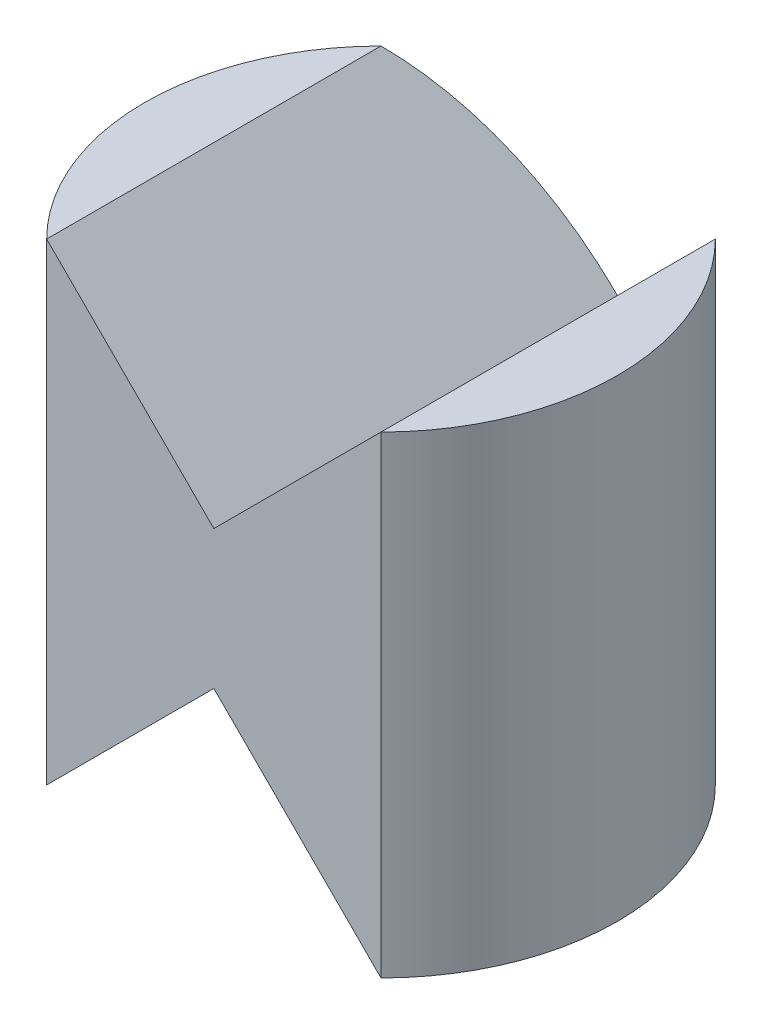
ISO-10303-21;
HEADER;
FILE_DESCRIPTION(('STEP AP214'),'2;1');
FILE_NAME('part.step','',(''),(''),'','','');
FILE_SCHEMA(('AUTOMOTIVE_DESIGN { 1 0 10303 214 1 1 1 1 }'));
ENDSEC;
DATA;
#1=APPLICATION_CONTEXT('core data for automotive mechanical design processes');
#2=APPLICATION_PROTOCOL_DEFINITION('international standard','automotive_design',2000,#1);
#3=PRODUCT_CONTEXT('',#1,'mechanical');
#4=PRODUCT('Part','Part','',(#3));
#5=PRODUCT_RELATED_PRODUCT_CATEGORY('part','',(#4));
#6=PRODUCT_DEFINITION_FORMATION('','',#4);
#7=PRODUCT_DEFINITION_CONTEXT('part definition',#1,'design');
#8=PRODUCT_DEFINITION('design','',#6,#7);
#9=PRODUCT_DEFINITION_SHAPE('','',#8);
#10=(LENGTH_UNIT() NAMED_UNIT(*) SI_UNIT(.MILLI.,.METRE.));
#11=(NAMED_UNIT(*) PLANE_ANGLE_UNIT() SI_UNIT($,.RADIAN.));
#12=(NAMED_UNIT(*) SI_UNIT($,.STERADIAN.) SOLID_ANGLE_UNIT());
#13=UNCERTAINTY_MEASURE_WITH_UNIT(LENGTH_MEASURE(1.E-05),#10,'distance_accuracy_value','');
#14=(GEOMETRIC_REPRESENTATION_CONTEXT(3) GLOBAL_UNCERTAINTY_ASSIGNED_CONTEXT((#13)) GLOBAL_UNIT_ASSIGNED_CONTEXT((#10,
#11,#12)) REPRESENTATION_CONTEXT('',''));
#15=CARTESIAN_POINT('',(0.,0.,0.));
#16=DIRECTION('',(0.,0.,1.));
#17=DIRECTION('',(1.,0.,0.));
#18=AXIS2_PLACEMENT_3D('',#15,#16,#17);
#19=CARTESIAN_POINT('',(0.,5.,0.));
#20=DIRECTION('',(0.,-1.,0.));
#21=DIRECTION('',(0.,0.,-1.));
#22=AXIS2_PLACEMENT_3D('',#19,#20,#21);
#23=PLANE('',#22);
#24=CARTESIAN_POINT('',(0.,5.,0.));
#25=DIRECTION('',(0.,1.,0.));
#26=DIRECTION('',(0.,0.,-1.));
#27=AXIS2_PLACEMENT_3D('',#24,#25,#26);
#28=CIRCLE('',#27,2.5);
#29=CARTESIAN_POINT('',(1.76776695296637,5.,1.76776695296637));
#30=VERTEX_POINT('',#29);
#31=CARTESIAN_POINT('',(1.76776695296637,5.,-1.76776695296637));
#32=VERTEX_POINT('',#31);
#33=EDGE_CURVE('E136',#30,#32,#28,.T.);
#34=ORIENTED_EDGE('',*,*,#33,.T.);
#35=DIRECTION('',(0.,0.,1.));
#36=VECTOR('',#35,1.);
#37=CARTESIAN_POINT('',(1.76776695296637,5.,-2.501));
#38=LINE('',#37,#36);
#39=EDGE_CURVE('E165',#32,#30,#38,.T.);
#40=ORIENTED_EDGE('',*,*,#39,.T.);
#41=EDGE_LOOP('',(#34,#40));
#42=FACE_BOUND('',#41,.T.);
#43=ADVANCED_FACE('F45',(#42),#23,.F.);
#44=CARTESIAN_POINT('',(0.,0.,0.));
#45=DIRECTION('',(0.,-1.,0.));
#46=DIRECTION('',(0.,0.,-1.));
#47=AXIS2_PLACEMENT_3D('',#44,#45,#46);
#48=PLANE('',#47);
#49=DIRECTION('',(0.,0.,1.));
#50=VECTOR('',#49,1.);
#51=CARTESIAN_POINT('',(-1.76776695296637,0.,-2.501));
#52=LINE('',#51,#50);
#53=CARTESIAN_POINT('',(-1.76776695296637,0.,-1.76776695296637));
#54=VERTEX_POINT('',#53);
#55=CARTESIAN_POINT('',(-1.76776695296637,0.,1.76776695296637));
#56=VERTEX_POINT('',#55);
#57=EDGE_CURVE('E149',#54,#56,#52,.T.);
#58=ORIENTED_EDGE('',*,*,#57,.T.);
#59=CARTESIAN_POINT('',(0.,0.,0.));
#60=DIRECTION('',(0.,1.,0.));
#61=DIRECTION('',(0.,0.,-1.));
#62=AXIS2_PLACEMENT_3D('',#59,#60,#61);
#63=CIRCLE('',#62,2.5);
#64=EDGE_CURVE('E142',#54,#56,#63,.T.);
#65=ORIENTED_EDGE('',*,*,#64,.F.);
#66=EDGE_LOOP('',(#58,#65));
#67=FACE_BOUND('',#66,.T.);
#68=ADVANCED_FACE('F207',(#67),#48,.T.);
#69=CARTESIAN_POINT('',(0.,5.,0.));
#70=DIRECTION('',(0.,-1.,0.));
#71=DIRECTION('',(0.,0.,-1.));
#72=AXIS2_PLACEMENT_3D('',#69,#70,#71);
#73=CYLINDRICAL_SURFACE('',#72,2.5);
#74=CARTESIAN_POINT('',(0.,1.76776695296637,0.));
#75=DIRECTION('',(0.707106781186547,0.707106781186547,0.));
#76=DIRECTION('',(0.707106781186548,-0.707106781186548,0.));
#77=AXIS2_PLACEMENT_3D('',#74,#75,#76);
#78=ELLIPSE('',#77,3.53553390593274,2.5);
#79=CARTESIAN_POINT('',(0.,1.76776695296637,-2.5));
#80=VERTEX_POINT('',#79);
#81=CARTESIAN_POINT('',(1.76776695296637,0.,-1.76776695296637));
#82=VERTEX_POINT('',#81);
#83=EDGE_CURVE('E75',#80,#82,#78,.F.);
#84=ORIENTED_EDGE('',*,*,#83,.F.);
#85=CARTESIAN_POINT('',(0.,1.76776695296637,0.));
#86=DIRECTION('',(-0.707106781186548,0.707106781186547,0.));
#87=DIRECTION('',(-0.707106781186547,-0.707106781186548,0.));
#88=AXIS2_PLACEMENT_3D('',#85,#86,#87);
#89=ELLIPSE('',#88,3.53553390593274,2.5);
#90=EDGE_CURVE('E130',#54,#80,#89,.F.);
#91=ORIENTED_EDGE('',*,*,#90,.F.);
#92=ORIENTED_EDGE('',*,*,#64,.T.);
#93=DIRECTION('',(0.,-1.,0.));
#94=VECTOR('',#93,1.);
#95=CARTESIAN_POINT('',(-1.76776695296637,5.,1.76776695296637));
#96=LINE('',#95,#94);
#97=CARTESIAN_POINT('',(-1.76776695296637,5.,1.76776695296637));
#98=VERTEX_POINT('',#97);
#99=EDGE_CURVE('E11',#98,#56,#96,.T.);
#100=ORIENTED_EDGE('',*,*,#99,.F.);
#101=CARTESIAN_POINT('',(-1.76776695296637,5.,-1.76776695296637));
#102=VERTEX_POINT('',#101);
#103=EDGE_CURVE('E141',#102,#98,#28,.T.);
#104=ORIENTED_EDGE('',*,*,#103,.F.);
#105=CARTESIAN_POINT('',(0.,3.23223304703363,0.));
#106=DIRECTION('',(-0.707106781186547,-0.707106781186547,0.));
#107=DIRECTION('',(0.707106781186548,-0.707106781186548,0.));
#108=AXIS2_PLACEMENT_3D('',#105,#106,#107);
#109=ELLIPSE('',#108,3.53553390593274,2.5);
#110=CARTESIAN_POINT('',(0.,3.23223304703363,-2.5));
#111=VERTEX_POINT('',#110);
#112=EDGE_CURVE('E66',#111,#102,#109,.F.);
#113=ORIENTED_EDGE('',*,*,#112,.F.);
#114=CARTESIAN_POINT('',(0.,3.23223304703363,0.));
#115=DIRECTION('',(0.707106781186547,-0.707106781186548,0.));
#116=DIRECTION('',(-0.707106781186548,-0.707106781186547,0.));
#117=AXIS2_PLACEMENT_3D('',#114,#115,#116);
#118=ELLIPSE('',#117,3.53553390593274,2.5);
#119=EDGE_CURVE('E175',#32,#111,#118,.F.);
#120=ORIENTED_EDGE('',*,*,#119,.F.);
#121=ORIENTED_EDGE('',*,*,#33,.F.);
#122=DIRECTION('',(0.,-1.,0.));
#123=VECTOR('',#122,1.);
#124=CARTESIAN_POINT('',(1.76776695296637,5.,1.76776695296637));
#125=LINE('',#124,#123);
#126=CARTESIAN_POINT('',(1.76776695296637,0.,1.76776695296637));
#127=VERTEX_POINT('',#126);
#128=EDGE_CURVE('E55',#30,#127,#125,.T.);
#129=ORIENTED_EDGE('',*,*,#128,.T.);
#130=EDGE_CURVE('E133',#127,#82,#63,.T.);
#131=ORIENTED_EDGE('',*,*,#130,.T.);
#132=EDGE_LOOP('',(#84,#91,#92,#100,#104,#113,#120,#121,#129,#131));
#133=FACE_BOUND('',#132,.T.);
#134=ADVANCED_FACE('F47',(#133),#73,.T.);
#135=CARTESIAN_POINT('',(-1.76776695296637,5.,1.76776695296637));
#136=DIRECTION('',(0.,0.,-1.));
#137=DIRECTION('',(-1.,0.,0.));
#138=AXIS2_PLACEMENT_3D('',#135,#136,#137);
#139=PLANE('',#138);
#140=ORIENTED_EDGE('',*,*,#99,.T.);
#141=DIRECTION('',(-0.707106781186547,-0.707106781186548,0.));
#142=VECTOR('',#141,1.);
#143=CARTESIAN_POINT('',(-1.76776695296637,0.,1.76776695296637));
#144=LINE('',#143,#142);
#145=CARTESIAN_POINT('',(0.,1.76776695296637,1.76776695296637));
#146=VERTEX_POINT('',#145);
#147=EDGE_CURVE('E121',#146,#56,#144,.T.);
#148=ORIENTED_EDGE('',*,*,#147,.F.);
#149=DIRECTION('',(-0.707106781186548,0.707106781186548,0.));
#150=VECTOR('',#149,1.);
#151=CARTESIAN_POINT('',(0.,1.76776695296637,1.76776695296637));
#152=LINE('',#151,#150);
#153=EDGE_CURVE('E114',#127,#146,#152,.T.);
#154=ORIENTED_EDGE('',*,*,#153,.F.);
#155=ORIENTED_EDGE('',*,*,#128,.F.);
#156=DIRECTION('',(0.707106781186548,0.707106781186547,0.));
#157=VECTOR('',#156,1.);
#158=CARTESIAN_POINT('',(0.,3.23223304703363,1.76776695296637));
#159=LINE('',#158,#157);
#160=CARTESIAN_POINT('',(0.,3.23223304703363,1.76776695296637));
#161=VERTEX_POINT('',#160);
#162=EDGE_CURVE('E183',#161,#30,#159,.T.);
#163=ORIENTED_EDGE('',*,*,#162,.F.);
#164=DIRECTION('',(0.707106781186547,-0.707106781186547,0.));
#165=VECTOR('',#164,1.);
#166=CARTESIAN_POINT('',(-1.76776695296637,5.,1.76776695296637));
#167=LINE('',#166,#165);
#168=EDGE_CURVE('E178',#98,#161,#167,.T.);
#169=ORIENTED_EDGE('',*,*,#168,.F.);
#170=EDGE_LOOP('',(#140,#148,#154,#155,#163,#169));
#171=FACE_BOUND('',#170,.T.);
#172=ADVANCED_FACE('F126',(#171),#139,.F.);
#173=ORIENTED_EDGE('',*,*,#103,.T.);
#174=DIRECTION('',(0.,0.,1.));
#175=VECTOR('',#174,1.);
#176=CARTESIAN_POINT('',(-1.76776695296637,5.,-2.501));
#177=LINE('',#176,#175);
#178=EDGE_CURVE('E171',#102,#98,#177,.T.);
#179=ORIENTED_EDGE('',*,*,#178,.F.);
#180=EDGE_LOOP('',(#173,#179));
#181=FACE_BOUND('',#180,.T.);
#182=ADVANCED_FACE('F215',(#181),#23,.F.);
#183=DIRECTION('',(0.,0.,1.));
#184=VECTOR('',#183,1.);
#185=CARTESIAN_POINT('',(1.76776695296637,0.,-2.501));
#186=LINE('',#185,#184);
#187=EDGE_CURVE('E111',#82,#127,#186,.T.);
#188=ORIENTED_EDGE('',*,*,#187,.F.);
#189=ORIENTED_EDGE('',*,*,#130,.F.);
#190=EDGE_LOOP('',(#188,#189));
#191=FACE_BOUND('',#190,.T.);
#192=ADVANCED_FACE('F139',(#191),#48,.T.);
#193=CARTESIAN_POINT('',(-1.76776695296637,0.,-2.501));
#194=DIRECTION('',(-0.707106781186548,0.707106781186547,0.));
#195=DIRECTION('',(-0.707106781186547,-0.707106781186548,0.));
#196=AXIS2_PLACEMENT_3D('',#193,#194,#195);
#197=PLANE('',#196);
#198=ORIENTED_EDGE('',*,*,#90,.T.);
#199=DIRECTION('',(0.,0.,1.));
#200=VECTOR('',#199,1.);
#201=CARTESIAN_POINT('',(0.,1.76776695296637,-2.501));
#202=LINE('',#201,#200);
#203=EDGE_CURVE('E120',#80,#146,#202,.T.);
#204=ORIENTED_EDGE('',*,*,#203,.T.);
#205=ORIENTED_EDGE('',*,*,#147,.T.);
#206=ORIENTED_EDGE('',*,*,#57,.F.);
#207=EDGE_LOOP('',(#198,#204,#205,#206));
#208=FACE_BOUND('',#207,.T.);
#209=ADVANCED_FACE('F203',(#208),#197,.F.);
#210=CARTESIAN_POINT('',(0.,1.76776695296637,-2.501));
#211=DIRECTION('',(0.707106781186547,0.707106781186547,0.));
#212=DIRECTION('',(-0.707106781186548,0.707106781186548,0.));
#213=AXIS2_PLACEMENT_3D('',#210,#211,#212);
#214=PLANE('',#213);
#215=ORIENTED_EDGE('',*,*,#83,.T.);
#216=ORIENTED_EDGE('',*,*,#187,.T.);
#217=ORIENTED_EDGE('',*,*,#153,.T.);
#218=ORIENTED_EDGE('',*,*,#203,.F.);
#219=EDGE_LOOP('',(#215,#216,#217,#218));
#220=FACE_BOUND('',#219,.T.);
#221=ADVANCED_FACE('F113',(#220),#214,.F.);
#222=CARTESIAN_POINT('',(0.,3.23223304703363,-2.501));
#223=DIRECTION('',(0.707106781186547,-0.707106781186548,0.));
#224=DIRECTION('',(0.707106781186548,0.707106781186547,0.));
#225=AXIS2_PLACEMENT_3D('',#222,#223,#224);
#226=PLANE('',#225);
#227=ORIENTED_EDGE('',*,*,#119,.T.);
#228=DIRECTION('',(0.,0.,1.));
#229=VECTOR('',#228,1.);
#230=CARTESIAN_POINT('',(0.,3.23223304703363,-2.501));
#231=LINE('',#230,#229);
#232=EDGE_CURVE('E158',#111,#161,#231,.T.);
#233=ORIENTED_EDGE('',*,*,#232,.T.);
#234=ORIENTED_EDGE('',*,*,#162,.T.);
#235=ORIENTED_EDGE('',*,*,#39,.F.);
#236=EDGE_LOOP('',(#227,#233,#234,#235));
#237=FACE_BOUND('',#236,.T.);
#238=ADVANCED_FACE('F230',(#237),#226,.F.);
#239=CARTESIAN_POINT('',(-1.76776695296637,5.,-2.501));
#240=DIRECTION('',(-0.707106781186547,-0.707106781186547,0.));
#241=DIRECTION('',(0.707106781186548,-0.707106781186548,0.));
#242=AXIS2_PLACEMENT_3D('',#239,#240,#241);
#243=PLANE('',#242);
#244=ORIENTED_EDGE('',*,*,#112,.T.);
#245=ORIENTED_EDGE('',*,*,#178,.T.);
#246=ORIENTED_EDGE('',*,*,#168,.T.);
#247=ORIENTED_EDGE('',*,*,#232,.F.);
#248=EDGE_LOOP('',(#244,#245,#246,#247));
#249=FACE_BOUND('',#248,.T.);
#250=ADVANCED_FACE('F227',(#249),#243,.F.);
#251=CLOSED_SHELL('',(#43,#68,#134,#172,#182,#192,#209,#221,#238,#250));
#252=MANIFOLD_SOLID_BREP('B2',#251);
#253=ADVANCED_BREP_SHAPE_REPRESENTATION('',(#18,#252),#14);
#254=SHAPE_DEFINITION_REPRESENTATION(#9,#253);
ENDSEC;
END-ISO-10303-21;
